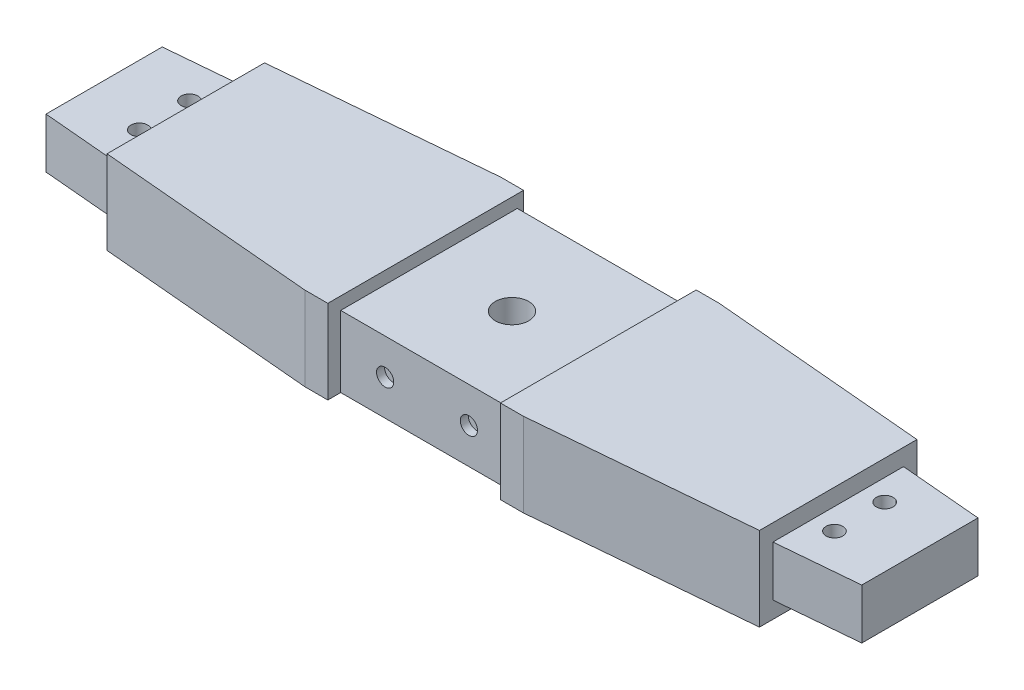
ISO-10303-21;
HEADER;
FILE_DESCRIPTION(('STEP AP214'),'2;1');
FILE_NAME('part.step','',(''),(''),'','','');
FILE_SCHEMA(('AUTOMOTIVE_DESIGN { 1 0 10303 214 1 1 1 1 }'));
ENDSEC;
DATA;
#1=APPLICATION_CONTEXT('core data for automotive mechanical design processes');
#2=APPLICATION_PROTOCOL_DEFINITION('international standard','automotive_design',2000,#1);
#3=PRODUCT_CONTEXT('',#1,'mechanical');
#4=PRODUCT('Part','Part','',(#3));
#5=PRODUCT_RELATED_PRODUCT_CATEGORY('part','',(#4));
#6=PRODUCT_DEFINITION_FORMATION('','',#4);
#7=PRODUCT_DEFINITION_CONTEXT('part definition',#1,'design');
#8=PRODUCT_DEFINITION('design','',#6,#7);
#9=PRODUCT_DEFINITION_SHAPE('','',#8);
#10=(LENGTH_UNIT() NAMED_UNIT(*) SI_UNIT(.MILLI.,.METRE.));
#11=(NAMED_UNIT(*) PLANE_ANGLE_UNIT() SI_UNIT($,.RADIAN.));
#12=(NAMED_UNIT(*) SI_UNIT($,.STERADIAN.) SOLID_ANGLE_UNIT());
#13=UNCERTAINTY_MEASURE_WITH_UNIT(LENGTH_MEASURE(1.E-05),#10,'distance_accuracy_value','');
#14=(GEOMETRIC_REPRESENTATION_CONTEXT(3) GLOBAL_UNCERTAINTY_ASSIGNED_CONTEXT((#13)) GLOBAL_UNIT_ASSIGNED_CONTEXT((#10,
#11,#12)) REPRESENTATION_CONTEXT('',''));
#15=CARTESIAN_POINT('',(0.,0.,0.));
#16=DIRECTION('',(0.,0.,1.));
#17=DIRECTION('',(1.,0.,0.));
#18=AXIS2_PLACEMENT_3D('',#15,#16,#17);
#19=CARTESIAN_POINT('',(0.,13.,0.));
#20=DIRECTION('',(0.,1.,0.));
#21=DIRECTION('',(0.,0.,1.));
#22=AXIS2_PLACEMENT_3D('',#19,#20,#21);
#23=PLANE('',#22);
#24=CARTESIAN_POINT('',(0.,13.,0.));
#25=DIRECTION('',(0.,1.,0.));
#26=DIRECTION('',(0.,0.,1.));
#27=AXIS2_PLACEMENT_3D('',#24,#25,#26);
#28=CIRCLE('',#27,3.99999999999999);
#29=CARTESIAN_POINT('',(0.,13.,3.99999999999999));
#30=VERTEX_POINT('',#29);
#31=EDGE_CURVE('E585',#30,#30,#28,.T.);
#32=ORIENTED_EDGE('',*,*,#31,.F.);
#33=EDGE_LOOP('',(#32));
#34=FACE_BOUND('',#33,.T.);
#35=DIRECTION('',(-1.,0.,0.));
#36=VECTOR('',#35,1.);
#37=CARTESIAN_POINT('',(20.6098777813811,13.,-21.87));
#38=LINE('',#37,#36);
#39=CARTESIAN_POINT('',(20.6098777813811,13.,-21.87));
#40=VERTEX_POINT('',#39);
#41=CARTESIAN_POINT('',(-20.6098777813811,13.,-21.87));
#42=VERTEX_POINT('',#41);
#43=EDGE_CURVE('E295',#40,#42,#38,.T.);
#44=ORIENTED_EDGE('',*,*,#43,.T.);
#45=DIRECTION('',(0.,0.,-1.));
#46=VECTOR('',#45,1.);
#47=CARTESIAN_POINT('',(-20.6098777813811,13.,23.37));
#48=LINE('',#47,#46);
#49=CARTESIAN_POINT('',(-20.6098777813811,13.,20.2957801884778));
#50=VERTEX_POINT('',#49);
#51=EDGE_CURVE('E258',#50,#42,#48,.T.);
#52=ORIENTED_EDGE('',*,*,#51,.F.);
#53=DIRECTION('',(1.,0.,0.));
#54=VECTOR('',#53,1.);
#55=CARTESIAN_POINT('',(-20.6098777813811,13.,20.2957801884778));
#56=LINE('',#55,#54);
#57=CARTESIAN_POINT('',(20.6098777813811,13.,20.2957801884778));
#58=VERTEX_POINT('',#57);
#59=EDGE_CURVE('E313',#50,#58,#56,.T.);
#60=ORIENTED_EDGE('',*,*,#59,.T.);
#61=DIRECTION('',(0.,0.,1.));
#62=VECTOR('',#61,1.);
#63=CARTESIAN_POINT('',(20.6098777813811,13.,-23.37));
#64=LINE('',#63,#62);
#65=EDGE_CURVE('E11',#40,#58,#64,.T.);
#66=ORIENTED_EDGE('',*,*,#65,.F.);
#67=EDGE_LOOP('',(#44,#52,#60,#66));
#68=FACE_BOUND('',#67,.T.);
#69=ADVANCED_FACE('F36',(#34,#68),#23,.T.);
#70=CARTESIAN_POINT('',(26.0807930555945,-4.00000000000002,-23.37));
#71=DIRECTION('',(0.,0.,-1.));
#72=DIRECTION('',(-1.,0.,0.));
#73=AXIS2_PLACEMENT_3D('',#70,#71,#72);
#74=PLANE('',#73);
#75=DIRECTION('',(0.,-1.,0.));
#76=VECTOR('',#75,1.);
#77=CARTESIAN_POINT('',(-20.6098777813811,13.,-23.37));
#78=LINE('',#77,#76);
#79=CARTESIAN_POINT('',(-20.6098777813811,16.,-23.37));
#80=VERTEX_POINT('',#79);
#81=CARTESIAN_POINT('',(-20.6098777813811,-4.00000000000002,-23.37));
#82=VERTEX_POINT('',#81);
#83=EDGE_CURVE('E95',#80,#82,#78,.T.);
#84=ORIENTED_EDGE('',*,*,#83,.T.);
#85=DIRECTION('',(-1.,0.,0.));
#86=VECTOR('',#85,1.);
#87=CARTESIAN_POINT('',(26.0807930555945,-4.00000000000002,-23.37));
#88=LINE('',#87,#86);
#89=CARTESIAN_POINT('',(-26.0807930555945,-4.00000000000002,-23.37));
#90=VERTEX_POINT('',#89);
#91=EDGE_CURVE('E348',#82,#90,#88,.T.);
#92=ORIENTED_EDGE('',*,*,#91,.T.);
#93=DIRECTION('',(0.,1.,0.));
#94=VECTOR('',#93,1.);
#95=CARTESIAN_POINT('',(-26.0807930555945,-4.00000000000002,-23.37));
#96=LINE('',#95,#94);
#97=CARTESIAN_POINT('',(-26.0807930555945,16.,-23.37));
#98=VERTEX_POINT('',#97);
#99=EDGE_CURVE('E362',#90,#98,#96,.T.);
#100=ORIENTED_EDGE('',*,*,#99,.T.);
#101=DIRECTION('',(-1.,0.,0.));
#102=VECTOR('',#101,1.);
#103=CARTESIAN_POINT('',(-20.6098777813811,16.,-23.37));
#104=LINE('',#103,#102);
#105=EDGE_CURVE('E257',#80,#98,#104,.T.);
#106=ORIENTED_EDGE('',*,*,#105,.F.);
#107=EDGE_LOOP('',(#84,#92,#100,#106));
#108=FACE_BOUND('',#107,.T.);
#109=ADVANCED_FACE('F446',(#108),#74,.T.);
#110=CARTESIAN_POINT('',(-26.0807930555945,-4.00000000000002,23.37));
#111=DIRECTION('',(0.,0.,1.));
#112=DIRECTION('',(1.,0.,0.));
#113=AXIS2_PLACEMENT_3D('',#110,#111,#112);
#114=PLANE('',#113);
#115=DIRECTION('',(0.,-1.,0.));
#116=VECTOR('',#115,1.);
#117=CARTESIAN_POINT('',(20.6098777813811,13.,23.37));
#118=LINE('',#117,#116);
#119=CARTESIAN_POINT('',(20.6098777813811,16.,23.37));
#120=VERTEX_POINT('',#119);
#121=CARTESIAN_POINT('',(20.6098777813811,-4.00000000000002,23.37));
#122=VERTEX_POINT('',#121);
#123=EDGE_CURVE('E316',#120,#122,#118,.T.);
#124=ORIENTED_EDGE('',*,*,#123,.T.);
#125=DIRECTION('',(1.,0.,0.));
#126=VECTOR('',#125,1.);
#127=CARTESIAN_POINT('',(-26.0807930555945,-4.00000000000002,23.37));
#128=LINE('',#127,#126);
#129=CARTESIAN_POINT('',(26.0807930555945,-4.00000000000002,23.37));
#130=VERTEX_POINT('',#129);
#131=EDGE_CURVE('E335',#122,#130,#128,.T.);
#132=ORIENTED_EDGE('',*,*,#131,.T.);
#133=DIRECTION('',(0.,1.,0.));
#134=VECTOR('',#133,1.);
#135=CARTESIAN_POINT('',(26.0807930555945,-4.00000000000002,23.37));
#136=LINE('',#135,#134);
#137=CARTESIAN_POINT('',(26.0807930555945,16.,23.37));
#138=VERTEX_POINT('',#137);
#139=EDGE_CURVE('E370',#130,#138,#136,.T.);
#140=ORIENTED_EDGE('',*,*,#139,.T.);
#141=DIRECTION('',(1.,0.,0.));
#142=VECTOR('',#141,1.);
#143=CARTESIAN_POINT('',(20.6098777813811,16.,23.37));
#144=LINE('',#143,#142);
#145=EDGE_CURVE('E279',#120,#138,#144,.T.);
#146=ORIENTED_EDGE('',*,*,#145,.F.);
#147=EDGE_LOOP('',(#124,#132,#140,#146));
#148=FACE_BOUND('',#147,.T.);
#149=ADVANCED_FACE('F452',(#148),#114,.T.);
#150=CARTESIAN_POINT('',(-77.9,-4.00000000000002,18.8061604361873));
#151=DIRECTION('',(-0.0877327517225181,0.,0.996144047954509));
#152=DIRECTION('',(0.996144047954509,0.,0.0877327517225181));
#153=AXIS2_PLACEMENT_3D('',#150,#151,#152);
#154=PLANE('',#153);
#155=DIRECTION('',(0.,1.,0.));
#156=VECTOR('',#155,1.);
#157=CARTESIAN_POINT('',(-26.0807930555945,-4.00000000000002,23.37));
#158=LINE('',#157,#156);
#159=CARTESIAN_POINT('',(-26.0807930555945,-4.00000000000002,23.37));
#160=VERTEX_POINT('',#159);
#161=CARTESIAN_POINT('',(-26.0807930555945,16.,23.37));
#162=VERTEX_POINT('',#161);
#163=EDGE_CURVE('E358',#160,#162,#158,.T.);
#164=ORIENTED_EDGE('',*,*,#163,.T.);
#165=DIRECTION('',(0.996144047954509,0.,0.0877327517225181));
#166=VECTOR('',#165,1.);
#167=CARTESIAN_POINT('',(-77.9,16.,18.8061604361873));
#168=LINE('',#167,#166);
#169=CARTESIAN_POINT('',(-77.9,16.,18.8061604361873));
#170=VERTEX_POINT('',#169);
#171=EDGE_CURVE('E267',#170,#162,#168,.T.);
#172=ORIENTED_EDGE('',*,*,#171,.F.);
#173=DIRECTION('',(0.,1.,0.));
#174=VECTOR('',#173,1.);
#175=CARTESIAN_POINT('',(-77.9,-4.00000000000002,18.8061604361873));
#176=LINE('',#175,#174);
#177=CARTESIAN_POINT('',(-77.9,-4.00000000000002,18.8061604361873));
#178=VERTEX_POINT('',#177);
#179=EDGE_CURVE('E46',#178,#170,#176,.T.);
#180=ORIENTED_EDGE('',*,*,#179,.F.);
#181=DIRECTION('',(0.996144047954509,0.,0.0877327517225181));
#182=VECTOR('',#181,1.);
#183=CARTESIAN_POINT('',(-77.9,-4.00000000000002,18.8061604361873));
#184=LINE('',#183,#182);
#185=EDGE_CURVE('E326',#178,#160,#184,.T.);
#186=ORIENTED_EDGE('',*,*,#185,.T.);
#187=EDGE_LOOP('',(#164,#172,#180,#186));
#188=FACE_BOUND('',#187,.T.);
#189=ADVANCED_FACE('F465',(#188),#154,.T.);
#190=CARTESIAN_POINT('',(-77.9,-4.00000000000002,-18.8061604361873));
#191=DIRECTION('',(-1.,0.,0.));
#192=DIRECTION('',(0.,0.,1.));
#193=AXIS2_PLACEMENT_3D('',#190,#191,#192);
#194=PLANE('',#193);
#195=DIRECTION('',(0.,1.,0.));
#196=VECTOR('',#195,1.);
#197=CARTESIAN_POINT('',(-77.9,12.,15.5963822751002));
#198=LINE('',#197,#196);
#199=CARTESIAN_POINT('',(-77.9,0.,15.5963822751002));
#200=VERTEX_POINT('',#199);
#201=CARTESIAN_POINT('',(-77.9,12.,15.5963822751002));
#202=VERTEX_POINT('',#201);
#203=EDGE_CURVE('E55',#200,#202,#198,.T.);
#204=ORIENTED_EDGE('',*,*,#203,.F.);
#205=DIRECTION('',(0.,0.,1.));
#206=VECTOR('',#205,1.);
#207=CARTESIAN_POINT('',(-77.9,0.,15.5963822751002));
#208=LINE('',#207,#206);
#209=CARTESIAN_POINT('',(-77.9,0.,-15.5963822751002));
#210=VERTEX_POINT('',#209);
#211=EDGE_CURVE('E235',#210,#200,#208,.T.);
#212=ORIENTED_EDGE('',*,*,#211,.F.);
#213=DIRECTION('',(0.,-1.,0.));
#214=VECTOR('',#213,1.);
#215=CARTESIAN_POINT('',(-77.9,0.,-15.5963822751002));
#216=LINE('',#215,#214);
#217=CARTESIAN_POINT('',(-77.9,12.,-15.5963822751002));
#218=VERTEX_POINT('',#217);
#219=EDGE_CURVE('E206',#218,#210,#216,.T.);
#220=ORIENTED_EDGE('',*,*,#219,.F.);
#221=DIRECTION('',(0.,0.,-1.));
#222=VECTOR('',#221,1.);
#223=CARTESIAN_POINT('',(-77.9,12.,-15.5963822751002));
#224=LINE('',#223,#222);
#225=EDGE_CURVE('E201',#202,#218,#224,.T.);
#226=ORIENTED_EDGE('',*,*,#225,.F.);
#227=EDGE_LOOP('',(#204,#212,#220,#226));
#228=FACE_BOUND('',#227,.T.);
#229=ORIENTED_EDGE('',*,*,#179,.T.);
#230=DIRECTION('',(0.,0.,1.));
#231=VECTOR('',#230,1.);
#232=CARTESIAN_POINT('',(-77.9,16.,-18.8061604361873));
#233=LINE('',#232,#231);
#234=CARTESIAN_POINT('',(-77.9,16.,-18.8061604361873));
#235=VERTEX_POINT('',#234);
#236=EDGE_CURVE('E264',#235,#170,#233,.T.);
#237=ORIENTED_EDGE('',*,*,#236,.F.);
#238=DIRECTION('',(0.,1.,0.));
#239=VECTOR('',#238,1.);
#240=CARTESIAN_POINT('',(-77.9,-4.00000000000002,-18.8061604361873));
#241=LINE('',#240,#239);
#242=CARTESIAN_POINT('',(-77.9,-4.00000000000002,-18.8061604361873));
#243=VERTEX_POINT('',#242);
#244=EDGE_CURVE('E360',#243,#235,#241,.T.);
#245=ORIENTED_EDGE('',*,*,#244,.F.);
#246=DIRECTION('',(0.,0.,1.));
#247=VECTOR('',#246,1.);
#248=CARTESIAN_POINT('',(-77.9,-4.00000000000002,-18.8061604361873));
#249=LINE('',#248,#247);
#250=EDGE_CURVE('E355',#243,#178,#249,.T.);
#251=ORIENTED_EDGE('',*,*,#250,.T.);
#252=EDGE_LOOP('',(#229,#237,#245,#251));
#253=FACE_BOUND('',#252,.T.);
#254=ADVANCED_FACE('F203',(#228,#253),#194,.T.);
#255=CARTESIAN_POINT('',(-26.0807930555945,-4.00000000000002,-23.37));
#256=DIRECTION('',(-0.0877327517225181,0.,-0.996144047954509));
#257=DIRECTION('',(-0.996144047954509,0.,0.0877327517225181));
#258=AXIS2_PLACEMENT_3D('',#255,#256,#257);
#259=PLANE('',#258);
#260=ORIENTED_EDGE('',*,*,#244,.T.);
#261=DIRECTION('',(-0.996144047954509,0.,0.0877327517225181));
#262=VECTOR('',#261,1.);
#263=CARTESIAN_POINT('',(-26.0807930555945,16.,-23.37));
#264=LINE('',#263,#262);
#265=EDGE_CURVE('E261',#98,#235,#264,.T.);
#266=ORIENTED_EDGE('',*,*,#265,.F.);
#267=ORIENTED_EDGE('',*,*,#99,.F.);
#268=DIRECTION('',(-0.996144047954509,0.,0.0877327517225181));
#269=VECTOR('',#268,1.);
#270=CARTESIAN_POINT('',(-26.0807930555945,-4.00000000000002,-23.37));
#271=LINE('',#270,#269);
#272=EDGE_CURVE('E352',#90,#243,#271,.T.);
#273=ORIENTED_EDGE('',*,*,#272,.T.);
#274=EDGE_LOOP('',(#260,#266,#267,#273));
#275=FACE_BOUND('',#274,.T.);
#276=ADVANCED_FACE('F464',(#275),#259,.T.);
#277=DIRECTION('',(0.,-1.,0.));
#278=VECTOR('',#277,1.);
#279=CARTESIAN_POINT('',(20.6098777813811,13.,-23.37));
#280=LINE('',#279,#278);
#281=CARTESIAN_POINT('',(20.6098777813811,16.,-23.37));
#282=VERTEX_POINT('',#281);
#283=CARTESIAN_POINT('',(20.6098777813811,-4.00000000000002,-23.37));
#284=VERTEX_POINT('',#283);
#285=EDGE_CURVE('E310',#282,#284,#280,.T.);
#286=ORIENTED_EDGE('',*,*,#285,.F.);
#287=DIRECTION('',(-1.,0.,0.));
#288=VECTOR('',#287,1.);
#289=CARTESIAN_POINT('',(26.0807930555945,16.,-23.37));
#290=LINE('',#289,#288);
#291=CARTESIAN_POINT('',(26.0807930555945,16.,-23.37));
#292=VERTEX_POINT('',#291);
#293=EDGE_CURVE('E291',#292,#282,#290,.T.);
#294=ORIENTED_EDGE('',*,*,#293,.F.);
#295=DIRECTION('',(0.,1.,0.));
#296=VECTOR('',#295,1.);
#297=CARTESIAN_POINT('',(26.0807930555945,-4.00000000000002,-23.37));
#298=LINE('',#297,#296);
#299=CARTESIAN_POINT('',(26.0807930555945,-4.00000000000002,-23.37));
#300=VERTEX_POINT('',#299);
#301=EDGE_CURVE('E364',#300,#292,#298,.T.);
#302=ORIENTED_EDGE('',*,*,#301,.F.);
#303=EDGE_CURVE('E349',#300,#284,#88,.T.);
#304=ORIENTED_EDGE('',*,*,#303,.T.);
#305=EDGE_LOOP('',(#286,#294,#302,#304));
#306=FACE_BOUND('',#305,.T.);
#307=ADVANCED_FACE('F455',(#306),#74,.T.);
#308=CARTESIAN_POINT('',(77.9,-4.00000000000002,-18.8061604361873));
#309=DIRECTION('',(0.0877327517225181,0.,-0.996144047954509));
#310=DIRECTION('',(-0.996144047954509,0.,-0.0877327517225181));
#311=AXIS2_PLACEMENT_3D('',#308,#309,#310);
#312=PLANE('',#311);
#313=ORIENTED_EDGE('',*,*,#301,.T.);
#314=DIRECTION('',(-0.996144047954509,0.,-0.0877327517225181));
#315=VECTOR('',#314,1.);
#316=CARTESIAN_POINT('',(77.9,16.,-18.8061604361873));
#317=LINE('',#316,#315);
#318=CARTESIAN_POINT('',(77.9,16.,-18.8061604361873));
#319=VERTEX_POINT('',#318);
#320=EDGE_CURVE('E288',#319,#292,#317,.T.);
#321=ORIENTED_EDGE('',*,*,#320,.F.);
#322=DIRECTION('',(0.,1.,0.));
#323=VECTOR('',#322,1.);
#324=CARTESIAN_POINT('',(77.9,-4.00000000000002,-18.8061604361873));
#325=LINE('',#324,#323);
#326=CARTESIAN_POINT('',(77.9,-4.00000000000002,-18.8061604361873));
#327=VERTEX_POINT('',#326);
#328=EDGE_CURVE('E366',#327,#319,#325,.T.);
#329=ORIENTED_EDGE('',*,*,#328,.F.);
#330=DIRECTION('',(-0.996144047954509,0.,-0.0877327517225181));
#331=VECTOR('',#330,1.);
#332=CARTESIAN_POINT('',(77.9,-4.00000000000002,-18.8061604361873));
#333=LINE('',#332,#331);
#334=EDGE_CURVE('E345',#327,#300,#333,.T.);
#335=ORIENTED_EDGE('',*,*,#334,.T.);
#336=EDGE_LOOP('',(#313,#321,#329,#335));
#337=FACE_BOUND('',#336,.T.);
#338=ADVANCED_FACE('F470',(#337),#312,.T.);
#339=CARTESIAN_POINT('',(77.9,-4.00000000000002,18.8061604361873));
#340=DIRECTION('',(1.,0.,0.));
#341=DIRECTION('',(0.,0.,-1.));
#342=AXIS2_PLACEMENT_3D('',#339,#340,#341);
#343=PLANE('',#342);
#344=DIRECTION('',(0.,1.,0.));
#345=VECTOR('',#344,1.);
#346=CARTESIAN_POINT('',(77.9,12.,-15.5963822751002));
#347=LINE('',#346,#345);
#348=CARTESIAN_POINT('',(77.9,0.,-15.5963822751002));
#349=VERTEX_POINT('',#348);
#350=CARTESIAN_POINT('',(77.9,12.,-15.5963822751002));
#351=VERTEX_POINT('',#350);
#352=EDGE_CURVE('E218',#349,#351,#347,.T.);
#353=ORIENTED_EDGE('',*,*,#352,.F.);
#354=DIRECTION('',(0.,0.,-1.));
#355=VECTOR('',#354,1.);
#356=CARTESIAN_POINT('',(77.9,0.,-15.5963822751002));
#357=LINE('',#356,#355);
#358=CARTESIAN_POINT('',(77.9,0.,15.5963822751002));
#359=VERTEX_POINT('',#358);
#360=EDGE_CURVE('E252',#359,#349,#357,.T.);
#361=ORIENTED_EDGE('',*,*,#360,.F.);
#362=DIRECTION('',(0.,-1.,0.));
#363=VECTOR('',#362,1.);
#364=CARTESIAN_POINT('',(77.9,0.,15.5963822751002));
#365=LINE('',#364,#363);
#366=CARTESIAN_POINT('',(77.9,12.,15.5963822751002));
#367=VERTEX_POINT('',#366);
#368=EDGE_CURVE('E249',#367,#359,#365,.T.);
#369=ORIENTED_EDGE('',*,*,#368,.F.);
#370=DIRECTION('',(0.,0.,1.));
#371=VECTOR('',#370,1.);
#372=CARTESIAN_POINT('',(77.9,12.,15.5963822751002));
#373=LINE('',#372,#371);
#374=EDGE_CURVE('E246',#351,#367,#373,.T.);
#375=ORIENTED_EDGE('',*,*,#374,.F.);
#376=EDGE_LOOP('',(#353,#361,#369,#375));
#377=FACE_BOUND('',#376,.T.);
#378=ORIENTED_EDGE('',*,*,#328,.T.);
#379=DIRECTION('',(0.,0.,-1.));
#380=VECTOR('',#379,1.);
#381=CARTESIAN_POINT('',(77.9,16.,18.8061604361873));
#382=LINE('',#381,#380);
#383=CARTESIAN_POINT('',(77.9,16.,18.8061604361873));
#384=VERTEX_POINT('',#383);
#385=EDGE_CURVE('E285',#384,#319,#382,.T.);
#386=ORIENTED_EDGE('',*,*,#385,.F.);
#387=DIRECTION('',(0.,1.,0.));
#388=VECTOR('',#387,1.);
#389=CARTESIAN_POINT('',(77.9,-4.00000000000002,18.8061604361873));
#390=LINE('',#389,#388);
#391=CARTESIAN_POINT('',(77.9,-4.00000000000002,18.8061604361873));
#392=VERTEX_POINT('',#391);
#393=EDGE_CURVE('E368',#392,#384,#390,.T.);
#394=ORIENTED_EDGE('',*,*,#393,.F.);
#395=DIRECTION('',(0.,0.,-1.));
#396=VECTOR('',#395,1.);
#397=CARTESIAN_POINT('',(77.9,-4.00000000000002,18.8061604361873));
#398=LINE('',#397,#396);
#399=EDGE_CURVE('E342',#392,#327,#398,.T.);
#400=ORIENTED_EDGE('',*,*,#399,.T.);
#401=EDGE_LOOP('',(#378,#386,#394,#400));
#402=FACE_BOUND('',#401,.T.);
#403=ADVANCED_FACE('F474',(#377,#402),#343,.T.);
#404=CARTESIAN_POINT('',(26.0807930555945,-4.00000000000002,23.37));
#405=DIRECTION('',(0.0877327517225181,0.,0.996144047954509));
#406=DIRECTION('',(0.996144047954509,0.,-0.0877327517225181));
#407=AXIS2_PLACEMENT_3D('',#404,#405,#406);
#408=PLANE('',#407);
#409=ORIENTED_EDGE('',*,*,#393,.T.);
#410=DIRECTION('',(0.996144047954509,0.,-0.0877327517225181));
#411=VECTOR('',#410,1.);
#412=CARTESIAN_POINT('',(26.0807930555945,16.,23.37));
#413=LINE('',#412,#411);
#414=EDGE_CURVE('E282',#138,#384,#413,.T.);
#415=ORIENTED_EDGE('',*,*,#414,.F.);
#416=ORIENTED_EDGE('',*,*,#139,.F.);
#417=DIRECTION('',(0.996144047954509,0.,-0.0877327517225181));
#418=VECTOR('',#417,1.);
#419=CARTESIAN_POINT('',(26.0807930555945,-4.00000000000002,23.37));
#420=LINE('',#419,#418);
#421=EDGE_CURVE('E339',#130,#392,#420,.T.);
#422=ORIENTED_EDGE('',*,*,#421,.T.);
#423=EDGE_LOOP('',(#409,#415,#416,#422));
#424=FACE_BOUND('',#423,.T.);
#425=ADVANCED_FACE('F478',(#424),#408,.T.);
#426=DIRECTION('',(0.,-1.,0.));
#427=VECTOR('',#426,1.);
#428=CARTESIAN_POINT('',(-20.6098777813811,13.,23.37));
#429=LINE('',#428,#427);
#430=CARTESIAN_POINT('',(-20.6098777813811,16.,23.37));
#431=VERTEX_POINT('',#430);
#432=CARTESIAN_POINT('',(-20.6098777813811,-4.00000000000002,23.37));
#433=VERTEX_POINT('',#432);
#434=EDGE_CURVE('E329',#431,#433,#429,.T.);
#435=ORIENTED_EDGE('',*,*,#434,.F.);
#436=DIRECTION('',(1.,0.,0.));
#437=VECTOR('',#436,1.);
#438=CARTESIAN_POINT('',(-26.0807930555945,16.,23.37));
#439=LINE('',#438,#437);
#440=EDGE_CURVE('E270',#162,#431,#439,.T.);
#441=ORIENTED_EDGE('',*,*,#440,.F.);
#442=ORIENTED_EDGE('',*,*,#163,.F.);
#443=EDGE_CURVE('E336',#160,#433,#128,.T.);
#444=ORIENTED_EDGE('',*,*,#443,.T.);
#445=EDGE_LOOP('',(#435,#441,#442,#444));
#446=FACE_BOUND('',#445,.T.);
#447=ADVANCED_FACE('F482',(#446),#114,.T.);
#448=CARTESIAN_POINT('',(0.,-4.00000000000002,0.));
#449=DIRECTION('',(0.,1.,0.));
#450=DIRECTION('',(0.,0.,1.));
#451=AXIS2_PLACEMENT_3D('',#448,#449,#450);
#452=PLANE('',#451);
#453=CARTESIAN_POINT('',(0.,-4.00000000000002,0.));
#454=DIRECTION('',(0.,-1.,0.));
#455=DIRECTION('',(0.,0.,-1.));
#456=AXIS2_PLACEMENT_3D('',#453,#454,#455);
#457=CIRCLE('',#456,3.99999999999999);
#458=CARTESIAN_POINT('',(0.,-4.00000000000002,-3.99999999999999));
#459=VERTEX_POINT('',#458);
#460=EDGE_CURVE('E583',#459,#459,#457,.T.);
#461=ORIENTED_EDGE('',*,*,#460,.F.);
#462=EDGE_LOOP('',(#461));
#463=FACE_BOUND('',#462,.T.);
#464=ORIENTED_EDGE('',*,*,#91,.F.);
#465=DIRECTION('',(0.,0.,-1.));
#466=VECTOR('',#465,1.);
#467=CARTESIAN_POINT('',(-20.6098777813811,-4.00000000000002,-21.87));
#468=LINE('',#467,#466);
#469=CARTESIAN_POINT('',(-20.6098777813811,-4.00000000000002,-21.87));
#470=VERTEX_POINT('',#469);
#471=EDGE_CURVE('E293',#470,#82,#468,.T.);
#472=ORIENTED_EDGE('',*,*,#471,.F.);
#473=DIRECTION('',(-1.,0.,0.));
#474=VECTOR('',#473,1.);
#475=CARTESIAN_POINT('',(20.6098777813811,-4.00000000000002,-21.87));
#476=LINE('',#475,#474);
#477=CARTESIAN_POINT('',(20.6098777813811,-4.00000000000002,-21.87));
#478=VERTEX_POINT('',#477);
#479=EDGE_CURVE('E298',#478,#470,#476,.T.);
#480=ORIENTED_EDGE('',*,*,#479,.F.);
#481=DIRECTION('',(0.,0.,1.));
#482=VECTOR('',#481,1.);
#483=CARTESIAN_POINT('',(20.6098777813811,-4.00000000000002,-23.37));
#484=LINE('',#483,#482);
#485=EDGE_CURVE('E300',#284,#478,#484,.T.);
#486=ORIENTED_EDGE('',*,*,#485,.F.);
#487=ORIENTED_EDGE('',*,*,#303,.F.);
#488=ORIENTED_EDGE('',*,*,#334,.F.);
#489=ORIENTED_EDGE('',*,*,#399,.F.);
#490=ORIENTED_EDGE('',*,*,#421,.F.);
#491=ORIENTED_EDGE('',*,*,#131,.F.);
#492=DIRECTION('',(0.,0.,1.));
#493=VECTOR('',#492,1.);
#494=CARTESIAN_POINT('',(20.6098777813811,-4.00000000000002,20.2957801884778));
#495=LINE('',#494,#493);
#496=CARTESIAN_POINT('',(20.6098777813811,-4.00000000000002,20.2957801884778));
#497=VERTEX_POINT('',#496);
#498=EDGE_CURVE('E307',#497,#122,#495,.T.);
#499=ORIENTED_EDGE('',*,*,#498,.F.);
#500=DIRECTION('',(1.,0.,0.));
#501=VECTOR('',#500,1.);
#502=CARTESIAN_POINT('',(-20.6098777813811,-4.00000000000002,20.2957801884778));
#503=LINE('',#502,#501);
#504=CARTESIAN_POINT('',(-20.6098777813811,-4.00000000000002,20.2957801884778));
#505=VERTEX_POINT('',#504);
#506=EDGE_CURVE('E317',#505,#497,#503,.T.);
#507=ORIENTED_EDGE('',*,*,#506,.F.);
#508=DIRECTION('',(0.,0.,-1.));
#509=VECTOR('',#508,1.);
#510=CARTESIAN_POINT('',(-20.6098777813811,-4.00000000000002,23.37));
#511=LINE('',#510,#509);
#512=EDGE_CURVE('E319',#433,#505,#511,.T.);
#513=ORIENTED_EDGE('',*,*,#512,.F.);
#514=ORIENTED_EDGE('',*,*,#443,.F.);
#515=ORIENTED_EDGE('',*,*,#185,.F.);
#516=ORIENTED_EDGE('',*,*,#250,.F.);
#517=ORIENTED_EDGE('',*,*,#272,.F.);
#518=EDGE_LOOP('',(#464,#472,#480,#486,#487,#488,#489,#490,#491,#499,#507,#513,#514,#515,#516,#517));
#519=FACE_BOUND('',#518,.T.);
#520=ADVANCED_FACE('F460',(#463,#519),#452,.F.);
#521=CARTESIAN_POINT('',(20.6098777813811,13.,20.2957801884778));
#522=DIRECTION('',(1.,0.,0.));
#523=DIRECTION('',(0.,1.,0.));
#524=AXIS2_PLACEMENT_3D('',#521,#522,#523);
#525=PLANE('',#524);
#526=ORIENTED_EDGE('',*,*,#498,.T.);
#527=ORIENTED_EDGE('',*,*,#123,.F.);
#528=DIRECTION('',(0.,0.,1.));
#529=VECTOR('',#528,1.);
#530=CARTESIAN_POINT('',(20.6098777813811,16.,20.2957801884778));
#531=LINE('',#530,#529);
#532=EDGE_CURVE('E273',#282,#120,#531,.T.);
#533=ORIENTED_EDGE('',*,*,#532,.F.);
#534=ORIENTED_EDGE('',*,*,#285,.T.);
#535=ORIENTED_EDGE('',*,*,#485,.T.);
#536=DIRECTION('',(0.,-1.,0.));
#537=VECTOR('',#536,1.);
#538=CARTESIAN_POINT('',(20.6098777813811,13.,-21.87));
#539=LINE('',#538,#537);
#540=EDGE_CURVE('E308',#40,#478,#539,.T.);
#541=ORIENTED_EDGE('',*,*,#540,.F.);
#542=ORIENTED_EDGE('',*,*,#65,.T.);
#543=DIRECTION('',(0.,-1.,0.));
#544=VECTOR('',#543,1.);
#545=CARTESIAN_POINT('',(20.6098777813811,13.,20.2957801884778));
#546=LINE('',#545,#544);
#547=EDGE_CURVE('E324',#58,#497,#546,.T.);
#548=ORIENTED_EDGE('',*,*,#547,.T.);
#549=EDGE_LOOP('',(#526,#527,#533,#534,#535,#541,#542,#548));
#550=FACE_BOUND('',#549,.T.);
#551=ADVANCED_FACE('F532',(#550),#525,.F.);
#552=CARTESIAN_POINT('',(-20.6098777813811,13.,20.2957801884778));
#553=DIRECTION('',(0.,0.,-1.));
#554=DIRECTION('',(-1.,0.,0.));
#555=AXIS2_PLACEMENT_3D('',#552,#553,#554);
#556=PLANE('',#555);
#557=CARTESIAN_POINT('',(-10.,4.5,20.2957801884778));
#558=DIRECTION('',(0.,0.,-1.));
#559=DIRECTION('',(-1.,0.,0.));
#560=AXIS2_PLACEMENT_3D('',#557,#558,#559);
#561=CIRCLE('',#560,2.04999999999999);
#562=CARTESIAN_POINT('',(-12.05,4.5,20.2957801884778));
#563=VERTEX_POINT('',#562);
#564=EDGE_CURVE('E393',#563,#563,#561,.T.);
#565=ORIENTED_EDGE('',*,*,#564,.T.);
#566=EDGE_LOOP('',(#565));
#567=FACE_BOUND('',#566,.T.);
#568=CARTESIAN_POINT('',(10.,4.5,20.2957801884778));
#569=DIRECTION('',(0.,0.,-1.));
#570=DIRECTION('',(-1.,0.,0.));
#571=AXIS2_PLACEMENT_3D('',#568,#569,#570);
#572=CIRCLE('',#571,2.04999999999999);
#573=CARTESIAN_POINT('',(7.95000000000001,4.5,20.2957801884778));
#574=VERTEX_POINT('',#573);
#575=EDGE_CURVE('E225',#574,#574,#572,.T.);
#576=ORIENTED_EDGE('',*,*,#575,.T.);
#577=EDGE_LOOP('',(#576));
#578=FACE_BOUND('',#577,.T.);
#579=ORIENTED_EDGE('',*,*,#506,.T.);
#580=ORIENTED_EDGE('',*,*,#547,.F.);
#581=ORIENTED_EDGE('',*,*,#59,.F.);
#582=DIRECTION('',(0.,-1.,0.));
#583=VECTOR('',#582,1.);
#584=CARTESIAN_POINT('',(-20.6098777813811,13.,20.2957801884778));
#585=LINE('',#584,#583);
#586=EDGE_CURVE('E327',#50,#505,#585,.T.);
#587=ORIENTED_EDGE('',*,*,#586,.T.);
#588=EDGE_LOOP('',(#579,#580,#581,#587));
#589=FACE_BOUND('',#588,.T.);
#590=ADVANCED_FACE('F544',(#567,#578,#589),#556,.F.);
#591=CARTESIAN_POINT('',(-20.6098777813811,13.,23.37));
#592=DIRECTION('',(-1.,0.,0.));
#593=DIRECTION('',(0.,-1.,0.));
#594=AXIS2_PLACEMENT_3D('',#591,#592,#593);
#595=PLANE('',#594);
#596=ORIENTED_EDGE('',*,*,#512,.T.);
#597=ORIENTED_EDGE('',*,*,#586,.F.);
#598=ORIENTED_EDGE('',*,*,#51,.T.);
#599=DIRECTION('',(0.,-1.,0.));
#600=VECTOR('',#599,1.);
#601=CARTESIAN_POINT('',(-20.6098777813811,13.,-21.87));
#602=LINE('',#601,#600);
#603=EDGE_CURVE('E305',#42,#470,#602,.T.);
#604=ORIENTED_EDGE('',*,*,#603,.T.);
#605=ORIENTED_EDGE('',*,*,#471,.T.);
#606=ORIENTED_EDGE('',*,*,#83,.F.);
#607=DIRECTION('',(0.,0.,-1.));
#608=VECTOR('',#607,1.);
#609=CARTESIAN_POINT('',(-20.6098777813811,16.,20.2957801884778));
#610=LINE('',#609,#608);
#611=EDGE_CURVE('E255',#431,#80,#610,.T.);
#612=ORIENTED_EDGE('',*,*,#611,.F.);
#613=ORIENTED_EDGE('',*,*,#434,.T.);
#614=EDGE_LOOP('',(#596,#597,#598,#604,#605,#606,#612,#613));
#615=FACE_BOUND('',#614,.T.);
#616=ADVANCED_FACE('F546',(#615),#595,.F.);
#617=CARTESIAN_POINT('',(20.6098777813811,13.,-21.87));
#618=DIRECTION('',(0.,0.,1.));
#619=DIRECTION('',(1.,0.,0.));
#620=AXIS2_PLACEMENT_3D('',#617,#618,#619);
#621=PLANE('',#620);
#622=ORIENTED_EDGE('',*,*,#479,.T.);
#623=ORIENTED_EDGE('',*,*,#603,.F.);
#624=ORIENTED_EDGE('',*,*,#43,.F.);
#625=ORIENTED_EDGE('',*,*,#540,.T.);
#626=EDGE_LOOP('',(#622,#623,#624,#625));
#627=FACE_BOUND('',#626,.T.);
#628=ADVANCED_FACE('F561',(#627),#621,.F.);
#629=CARTESIAN_POINT('',(0.,16.,0.));
#630=DIRECTION('',(0.,1.,0.));
#631=DIRECTION('',(-1.,0.,0.));
#632=AXIS2_PLACEMENT_3D('',#629,#630,#631);
#633=PLANE('',#632);
#634=ORIENTED_EDGE('',*,*,#532,.T.);
#635=ORIENTED_EDGE('',*,*,#145,.T.);
#636=ORIENTED_EDGE('',*,*,#414,.T.);
#637=ORIENTED_EDGE('',*,*,#385,.T.);
#638=ORIENTED_EDGE('',*,*,#320,.T.);
#639=ORIENTED_EDGE('',*,*,#293,.T.);
#640=EDGE_LOOP('',(#634,#635,#636,#637,#638,#639));
#641=FACE_BOUND('',#640,.T.);
#642=ADVANCED_FACE('F521',(#641),#633,.T.);
#643=CARTESIAN_POINT('',(0.,16.,0.));
#644=DIRECTION('',(0.,1.,0.));
#645=DIRECTION('',(-1.,0.,0.));
#646=AXIS2_PLACEMENT_3D('',#643,#644,#645);
#647=PLANE('',#646);
#648=ORIENTED_EDGE('',*,*,#611,.T.);
#649=ORIENTED_EDGE('',*,*,#105,.T.);
#650=ORIENTED_EDGE('',*,*,#265,.T.);
#651=ORIENTED_EDGE('',*,*,#236,.T.);
#652=ORIENTED_EDGE('',*,*,#171,.T.);
#653=ORIENTED_EDGE('',*,*,#440,.T.);
#654=EDGE_LOOP('',(#648,#649,#650,#651,#652,#653));
#655=FACE_BOUND('',#654,.T.);
#656=ADVANCED_FACE('F552',(#655),#647,.T.);
#657=CARTESIAN_POINT('',(77.9,12.,-15.5963822751002));
#658=DIRECTION('',(0.0877327517225218,0.,-0.996144047954509));
#659=DIRECTION('',(-0.996144047954509,0.,-0.0877327517225218));
#660=AXIS2_PLACEMENT_3D('',#657,#658,#659);
#661=PLANE('',#660);
#662=ORIENTED_EDGE('',*,*,#352,.T.);
#663=DIRECTION('',(0.996144047954509,0.,0.0877327517225218));
#664=VECTOR('',#663,1.);
#665=CARTESIAN_POINT('',(99.9759825684482,12.,-13.6520985124402));
#666=LINE('',#665,#664);
#667=CARTESIAN_POINT('',(97.4,12.,-13.8789713623892));
#668=VERTEX_POINT('',#667);
#669=EDGE_CURVE('E276',#668,#351,#666,.F.);
#670=ORIENTED_EDGE('',*,*,#669,.F.);
#671=DIRECTION('',(0.,-1.,0.));
#672=VECTOR('',#671,1.);
#673=CARTESIAN_POINT('',(97.4,0.,-13.8789713623892));
#674=LINE('',#673,#672);
#675=CARTESIAN_POINT('',(97.4,0.,-13.8789713623892));
#676=VERTEX_POINT('',#675);
#677=EDGE_CURVE('E241',#676,#668,#674,.F.);
#678=ORIENTED_EDGE('',*,*,#677,.F.);
#679=DIRECTION('',(0.996144047954509,0.,0.0877327517225218));
#680=VECTOR('',#679,1.);
#681=CARTESIAN_POINT('',(77.9,0.,-15.5963822751002));
#682=LINE('',#681,#680);
#683=EDGE_CURVE('E243',#676,#349,#682,.F.);
#684=ORIENTED_EDGE('',*,*,#683,.T.);
#685=EDGE_LOOP('',(#662,#670,#678,#684));
#686=FACE_BOUND('',#685,.T.);
#687=ADVANCED_FACE('F38',(#686),#661,.T.);
#688=CARTESIAN_POINT('',(97.4,12.,15.5963822751002));
#689=DIRECTION('',(0.,-1.,0.));
#690=DIRECTION('',(0.,0.,-1.));
#691=AXIS2_PLACEMENT_3D('',#688,#689,#690);
#692=PLANE('',#691);
#693=CARTESIAN_POINT('',(83.,12.,6.));
#694=DIRECTION('',(0.,1.,0.));
#695=DIRECTION('',(0.,0.,1.));
#696=AXIS2_PLACEMENT_3D('',#693,#694,#695);
#697=CIRCLE('',#696,1.99999999999999);
#698=CARTESIAN_POINT('',(83.,12.,7.99999999999999));
#699=VERTEX_POINT('',#698);
#700=EDGE_CURVE('E403',#699,#699,#697,.T.);
#701=ORIENTED_EDGE('',*,*,#700,.F.);
#702=EDGE_LOOP('',(#701));
#703=FACE_BOUND('',#702,.T.);
#704=CARTESIAN_POINT('',(83.,12.,-6.));
#705=DIRECTION('',(0.,1.,0.));
#706=DIRECTION('',(0.,0.,1.));
#707=AXIS2_PLACEMENT_3D('',#704,#705,#706);
#708=CIRCLE('',#707,1.99999999999999);
#709=CARTESIAN_POINT('',(83.,12.,-4.00000000000001));
#710=VERTEX_POINT('',#709);
#711=EDGE_CURVE('E400',#710,#710,#708,.T.);
#712=ORIENTED_EDGE('',*,*,#711,.F.);
#713=EDGE_LOOP('',(#712));
#714=FACE_BOUND('',#713,.T.);
#715=ORIENTED_EDGE('',*,*,#374,.T.);
#716=DIRECTION('',(0.996144047954509,0.,-0.0877327517225218));
#717=VECTOR('',#716,1.);
#718=CARTESIAN_POINT('',(77.9,12.,15.5963822751002));
#719=LINE('',#718,#717);
#720=CARTESIAN_POINT('',(97.4,12.,13.8789713623892));
#721=VERTEX_POINT('',#720);
#722=EDGE_CURVE('E381',#721,#367,#719,.F.);
#723=ORIENTED_EDGE('',*,*,#722,.F.);
#724=DIRECTION('',(0.,0.,1.));
#725=VECTOR('',#724,1.);
#726=CARTESIAN_POINT('',(97.4,12.,15.5963822751002));
#727=LINE('',#726,#725);
#728=EDGE_CURVE('E238',#668,#721,#727,.T.);
#729=ORIENTED_EDGE('',*,*,#728,.F.);
#730=ORIENTED_EDGE('',*,*,#669,.T.);
#731=EDGE_LOOP('',(#715,#723,#729,#730));
#732=FACE_BOUND('',#731,.T.);
#733=ADVANCED_FACE('F495',(#703,#714,#732),#692,.F.);
#734=CARTESIAN_POINT('',(77.9,0.,15.5963822751002));
#735=DIRECTION('',(0.0877327517225218,0.,0.996144047954509));
#736=DIRECTION('',(0.996144047954509,0.,-0.0877327517225218));
#737=AXIS2_PLACEMENT_3D('',#734,#735,#736);
#738=PLANE('',#737);
#739=ORIENTED_EDGE('',*,*,#368,.T.);
#740=DIRECTION('',(0.996144047954509,0.,-0.0877327517225218));
#741=VECTOR('',#740,1.);
#742=CARTESIAN_POINT('',(99.9759825684482,0.,13.6520985124402));
#743=LINE('',#742,#741);
#744=CARTESIAN_POINT('',(97.4,0.,13.8789713623892));
#745=VERTEX_POINT('',#744);
#746=EDGE_CURVE('E384',#745,#359,#743,.F.);
#747=ORIENTED_EDGE('',*,*,#746,.F.);
#748=DIRECTION('',(0.,1.,0.));
#749=VECTOR('',#748,1.);
#750=CARTESIAN_POINT('',(97.4,0.,13.8789713623892));
#751=LINE('',#750,#749);
#752=EDGE_CURVE('E240',#721,#745,#751,.F.);
#753=ORIENTED_EDGE('',*,*,#752,.F.);
#754=ORIENTED_EDGE('',*,*,#722,.T.);
#755=EDGE_LOOP('',(#739,#747,#753,#754));
#756=FACE_BOUND('',#755,.T.);
#757=ADVANCED_FACE('F492',(#756),#738,.T.);
#758=CARTESIAN_POINT('',(97.4,0.,-15.5963822751002));
#759=DIRECTION('',(0.,1.,0.));
#760=DIRECTION('',(0.,0.,1.));
#761=AXIS2_PLACEMENT_3D('',#758,#759,#760);
#762=PLANE('',#761);
#763=CARTESIAN_POINT('',(83.,0.,6.));
#764=DIRECTION('',(0.,1.,0.));
#765=DIRECTION('',(0.,0.,1.));
#766=AXIS2_PLACEMENT_3D('',#763,#764,#765);
#767=CIRCLE('',#766,1.99999999999999);
#768=CARTESIAN_POINT('',(83.,0.,7.99999999999999));
#769=VERTEX_POINT('',#768);
#770=EDGE_CURVE('E401',#769,#769,#767,.T.);
#771=ORIENTED_EDGE('',*,*,#770,.T.);
#772=EDGE_LOOP('',(#771));
#773=FACE_BOUND('',#772,.T.);
#774=CARTESIAN_POINT('',(83.,0.,-6.));
#775=DIRECTION('',(0.,1.,0.));
#776=DIRECTION('',(0.,0.,1.));
#777=AXIS2_PLACEMENT_3D('',#774,#775,#776);
#778=CIRCLE('',#777,1.99999999999999);
#779=CARTESIAN_POINT('',(83.,0.,-4.00000000000001));
#780=VERTEX_POINT('',#779);
#781=EDGE_CURVE('E397',#780,#780,#778,.T.);
#782=ORIENTED_EDGE('',*,*,#781,.T.);
#783=EDGE_LOOP('',(#782));
#784=FACE_BOUND('',#783,.T.);
#785=ORIENTED_EDGE('',*,*,#360,.T.);
#786=ORIENTED_EDGE('',*,*,#683,.F.);
#787=DIRECTION('',(0.,0.,-1.));
#788=VECTOR('',#787,1.);
#789=CARTESIAN_POINT('',(97.4,0.,-15.5963822751002));
#790=LINE('',#789,#788);
#791=EDGE_CURVE('E86',#745,#676,#790,.T.);
#792=ORIENTED_EDGE('',*,*,#791,.F.);
#793=ORIENTED_EDGE('',*,*,#746,.T.);
#794=EDGE_LOOP('',(#785,#786,#792,#793));
#795=FACE_BOUND('',#794,.T.);
#796=ADVANCED_FACE('F494',(#773,#784,#795),#762,.F.);
#797=CARTESIAN_POINT('',(97.4,0.,0.));
#798=DIRECTION('',(-1.,0.,0.));
#799=DIRECTION('',(0.,0.,1.));
#800=AXIS2_PLACEMENT_3D('',#797,#798,#799);
#801=PLANE('',#800);
#802=ORIENTED_EDGE('',*,*,#677,.T.);
#803=ORIENTED_EDGE('',*,*,#728,.T.);
#804=ORIENTED_EDGE('',*,*,#752,.T.);
#805=ORIENTED_EDGE('',*,*,#791,.T.);
#806=EDGE_LOOP('',(#802,#803,#804,#805));
#807=FACE_BOUND('',#806,.T.);
#808=ADVANCED_FACE('F491',(#807),#801,.F.);
#809=CARTESIAN_POINT('',(-77.9,12.,15.5963822751002));
#810=DIRECTION('',(-0.0877327517225218,0.,0.996144047954509));
#811=DIRECTION('',(0.996144047954509,0.,0.0877327517225218));
#812=AXIS2_PLACEMENT_3D('',#809,#810,#811);
#813=PLANE('',#812);
#814=ORIENTED_EDGE('',*,*,#203,.T.);
#815=DIRECTION('',(-0.996144047954509,0.,-0.0877327517225218));
#816=VECTOR('',#815,1.);
#817=CARTESIAN_POINT('',(-99.9759825684482,12.,13.6520985124402));
#818=LINE('',#817,#816);
#819=CARTESIAN_POINT('',(-97.4,12.,13.8789713623892));
#820=VERTEX_POINT('',#819);
#821=EDGE_CURVE('E212',#820,#202,#818,.F.);
#822=ORIENTED_EDGE('',*,*,#821,.F.);
#823=DIRECTION('',(0.,-1.,0.));
#824=VECTOR('',#823,1.);
#825=CARTESIAN_POINT('',(-97.4,0.,13.8789713623892));
#826=LINE('',#825,#824);
#827=CARTESIAN_POINT('',(-97.4,0.,13.8789713623892));
#828=VERTEX_POINT('',#827);
#829=EDGE_CURVE('E237',#828,#820,#826,.F.);
#830=ORIENTED_EDGE('',*,*,#829,.F.);
#831=DIRECTION('',(-0.996144047954509,0.,-0.0877327517225218));
#832=VECTOR('',#831,1.);
#833=CARTESIAN_POINT('',(-77.9,0.,15.5963822751002));
#834=LINE('',#833,#832);
#835=EDGE_CURVE('E224',#828,#200,#834,.F.);
#836=ORIENTED_EDGE('',*,*,#835,.T.);
#837=EDGE_LOOP('',(#814,#822,#830,#836));
#838=FACE_BOUND('',#837,.T.);
#839=ADVANCED_FACE('F222',(#838),#813,.T.);
#840=CARTESIAN_POINT('',(-97.4,12.,-15.5963822751002));
#841=DIRECTION('',(0.,-1.,0.));
#842=DIRECTION('',(0.,0.,-1.));
#843=AXIS2_PLACEMENT_3D('',#840,#841,#842);
#844=PLANE('',#843);
#845=CARTESIAN_POINT('',(-83.,12.,-6.));
#846=DIRECTION('',(0.,1.,0.));
#847=DIRECTION('',(0.,0.,1.));
#848=AXIS2_PLACEMENT_3D('',#845,#846,#847);
#849=CIRCLE('',#848,1.99999999999999);
#850=CARTESIAN_POINT('',(-83.,12.,-4.00000000000001));
#851=VERTEX_POINT('',#850);
#852=EDGE_CURVE('E416',#851,#851,#849,.T.);
#853=ORIENTED_EDGE('',*,*,#852,.F.);
#854=EDGE_LOOP('',(#853));
#855=FACE_BOUND('',#854,.T.);
#856=CARTESIAN_POINT('',(-83.,12.,6.));
#857=DIRECTION('',(0.,1.,0.));
#858=DIRECTION('',(0.,0.,1.));
#859=AXIS2_PLACEMENT_3D('',#856,#857,#858);
#860=CIRCLE('',#859,1.99999999999999);
#861=CARTESIAN_POINT('',(-83.,12.,7.99999999999999));
#862=VERTEX_POINT('',#861);
#863=EDGE_CURVE('E406',#862,#862,#860,.T.);
#864=ORIENTED_EDGE('',*,*,#863,.F.);
#865=EDGE_LOOP('',(#864));
#866=FACE_BOUND('',#865,.T.);
#867=ORIENTED_EDGE('',*,*,#225,.T.);
#868=DIRECTION('',(-0.996144047954509,0.,0.0877327517225218));
#869=VECTOR('',#868,1.);
#870=CARTESIAN_POINT('',(-77.9,12.,-15.5963822751002));
#871=LINE('',#870,#869);
#872=CARTESIAN_POINT('',(-97.4,12.,-13.8789713623892));
#873=VERTEX_POINT('',#872);
#874=EDGE_CURVE('E219',#873,#218,#871,.F.);
#875=ORIENTED_EDGE('',*,*,#874,.F.);
#876=DIRECTION('',(0.,0.,-1.));
#877=VECTOR('',#876,1.);
#878=CARTESIAN_POINT('',(-97.4,12.,-15.5963822751002));
#879=LINE('',#878,#877);
#880=EDGE_CURVE('E214',#820,#873,#879,.T.);
#881=ORIENTED_EDGE('',*,*,#880,.F.);
#882=ORIENTED_EDGE('',*,*,#821,.T.);
#883=EDGE_LOOP('',(#867,#875,#881,#882));
#884=FACE_BOUND('',#883,.T.);
#885=ADVANCED_FACE('F213',(#855,#866,#884),#844,.F.);
#886=CARTESIAN_POINT('',(-77.9,0.,-15.5963822751002));
#887=DIRECTION('',(-0.0877327517225218,0.,-0.996144047954509));
#888=DIRECTION('',(-0.996144047954509,0.,0.0877327517225218));
#889=AXIS2_PLACEMENT_3D('',#886,#887,#888);
#890=PLANE('',#889);
#891=ORIENTED_EDGE('',*,*,#219,.T.);
#892=DIRECTION('',(-0.996144047954509,0.,0.0877327517225218));
#893=VECTOR('',#892,1.);
#894=CARTESIAN_POINT('',(-99.9759825684482,0.,-13.6520985124402));
#895=LINE('',#894,#893);
#896=CARTESIAN_POINT('',(-97.4,0.,-13.8789713623892));
#897=VERTEX_POINT('',#896);
#898=EDGE_CURVE('E374',#897,#210,#895,.F.);
#899=ORIENTED_EDGE('',*,*,#898,.F.);
#900=DIRECTION('',(0.,1.,0.));
#901=VECTOR('',#900,1.);
#902=CARTESIAN_POINT('',(-97.4,0.,-13.8789713623892));
#903=LINE('',#902,#901);
#904=EDGE_CURVE('E377',#873,#897,#903,.F.);
#905=ORIENTED_EDGE('',*,*,#904,.F.);
#906=ORIENTED_EDGE('',*,*,#874,.T.);
#907=EDGE_LOOP('',(#891,#899,#905,#906));
#908=FACE_BOUND('',#907,.T.);
#909=ADVANCED_FACE('F430',(#908),#890,.T.);
#910=CARTESIAN_POINT('',(-97.4,0.,15.5963822751002));
#911=DIRECTION('',(0.,1.,0.));
#912=DIRECTION('',(0.,0.,1.));
#913=AXIS2_PLACEMENT_3D('',#910,#911,#912);
#914=PLANE('',#913);
#915=CARTESIAN_POINT('',(-83.,0.,-6.));
#916=DIRECTION('',(0.,1.,0.));
#917=DIRECTION('',(0.,0.,1.));
#918=AXIS2_PLACEMENT_3D('',#915,#916,#917);
#919=CIRCLE('',#918,1.99999999999999);
#920=CARTESIAN_POINT('',(-83.,0.,-4.00000000000001));
#921=VERTEX_POINT('',#920);
#922=EDGE_CURVE('E40',#921,#921,#919,.T.);
#923=ORIENTED_EDGE('',*,*,#922,.T.);
#924=EDGE_LOOP('',(#923));
#925=FACE_BOUND('',#924,.T.);
#926=CARTESIAN_POINT('',(-83.,0.,6.));
#927=DIRECTION('',(0.,1.,0.));
#928=DIRECTION('',(0.,0.,1.));
#929=AXIS2_PLACEMENT_3D('',#926,#927,#928);
#930=CIRCLE('',#929,1.99999999999999);
#931=CARTESIAN_POINT('',(-83.,0.,7.99999999999999));
#932=VERTEX_POINT('',#931);
#933=EDGE_CURVE('E404',#932,#932,#930,.T.);
#934=ORIENTED_EDGE('',*,*,#933,.T.);
#935=EDGE_LOOP('',(#934));
#936=FACE_BOUND('',#935,.T.);
#937=ORIENTED_EDGE('',*,*,#211,.T.);
#938=ORIENTED_EDGE('',*,*,#835,.F.);
#939=DIRECTION('',(0.,0.,1.));
#940=VECTOR('',#939,1.);
#941=CARTESIAN_POINT('',(-97.4,0.,15.5963822751002));
#942=LINE('',#941,#940);
#943=EDGE_CURVE('E231',#897,#828,#942,.T.);
#944=ORIENTED_EDGE('',*,*,#943,.F.);
#945=ORIENTED_EDGE('',*,*,#898,.T.);
#946=EDGE_LOOP('',(#937,#938,#944,#945));
#947=FACE_BOUND('',#946,.T.);
#948=ADVANCED_FACE('F433',(#925,#936,#947),#914,.F.);
#949=CARTESIAN_POINT('',(-97.4,0.,0.));
#950=DIRECTION('',(1.,0.,0.));
#951=DIRECTION('',(0.,0.,-1.));
#952=AXIS2_PLACEMENT_3D('',#949,#950,#951);
#953=PLANE('',#952);
#954=ORIENTED_EDGE('',*,*,#829,.T.);
#955=ORIENTED_EDGE('',*,*,#880,.T.);
#956=ORIENTED_EDGE('',*,*,#904,.T.);
#957=ORIENTED_EDGE('',*,*,#943,.T.);
#958=EDGE_LOOP('',(#954,#955,#956,#957));
#959=FACE_BOUND('',#958,.T.);
#960=ADVANCED_FACE('F426',(#959),#953,.F.);
#961=CARTESIAN_POINT('',(10.,4.5,23.37));
#962=DIRECTION('',(0.,0.,1.));
#963=DIRECTION('',(1.,0.,0.));
#964=AXIS2_PLACEMENT_3D('',#961,#962,#963);
#965=CYLINDRICAL_SURFACE('',#964,2.04999999999999);
#966=CARTESIAN_POINT('',(10.,4.5,18.37));
#967=DIRECTION('',(0.,0.,1.));
#968=DIRECTION('',(1.,0.,0.));
#969=AXIS2_PLACEMENT_3D('',#966,#967,#968);
#970=CIRCLE('',#969,2.04999999999999);
#971=CARTESIAN_POINT('',(12.05,4.5,18.37));
#972=VERTEX_POINT('',#971);
#973=EDGE_CURVE('E228',#972,#972,#970,.T.);
#974=ORIENTED_EDGE('',*,*,#973,.F.);
#975=EDGE_LOOP('',(#974));
#976=FACE_BOUND('',#975,.T.);
#977=ORIENTED_EDGE('',*,*,#575,.F.);
#978=EDGE_LOOP('',(#977));
#979=FACE_BOUND('',#978,.T.);
#980=ADVANCED_FACE('F441',(#976,#979),#965,.F.);
#981=CARTESIAN_POINT('',(10.,4.5,18.37));
#982=DIRECTION('',(0.,0.,-1.));
#983=DIRECTION('',(-1.,0.,0.));
#984=AXIS2_PLACEMENT_3D('',#981,#982,#983);
#985=PLANE('',#984);
#986=ORIENTED_EDGE('',*,*,#973,.T.);
#987=EDGE_LOOP('',(#986));
#988=FACE_BOUND('',#987,.T.);
#989=ADVANCED_FACE('F703',(#988),#985,.F.);
#990=CARTESIAN_POINT('',(-10.,4.5,23.37));
#991=DIRECTION('',(0.,0.,1.));
#992=DIRECTION('',(1.,0.,0.));
#993=AXIS2_PLACEMENT_3D('',#990,#991,#992);
#994=CYLINDRICAL_SURFACE('',#993,2.04999999999999);
#995=CARTESIAN_POINT('',(-10.,4.5,18.37));
#996=DIRECTION('',(0.,0.,1.));
#997=DIRECTION('',(1.,0.,0.));
#998=AXIS2_PLACEMENT_3D('',#995,#996,#997);
#999=CIRCLE('',#998,2.04999999999999);
#1000=CARTESIAN_POINT('',(-7.95000000000001,4.5,18.37));
#1001=VERTEX_POINT('',#1000);
#1002=EDGE_CURVE('E396',#1001,#1001,#999,.T.);
#1003=ORIENTED_EDGE('',*,*,#1002,.F.);
#1004=EDGE_LOOP('',(#1003));
#1005=FACE_BOUND('',#1004,.T.);
#1006=ORIENTED_EDGE('',*,*,#564,.F.);
#1007=EDGE_LOOP('',(#1006));
#1008=FACE_BOUND('',#1007,.T.);
#1009=ADVANCED_FACE('F700',(#1005,#1008),#994,.F.);
#1010=CARTESIAN_POINT('',(-10.,4.5,18.37));
#1011=DIRECTION('',(0.,0.,-1.));
#1012=DIRECTION('',(-1.,0.,0.));
#1013=AXIS2_PLACEMENT_3D('',#1010,#1011,#1012);
#1014=PLANE('',#1013);
#1015=ORIENTED_EDGE('',*,*,#1002,.T.);
#1016=EDGE_LOOP('',(#1015));
#1017=FACE_BOUND('',#1016,.T.);
#1018=ADVANCED_FACE('F619',(#1017),#1014,.F.);
#1019=CARTESIAN_POINT('',(83.,12.,-6.));
#1020=DIRECTION('',(0.,1.,0.));
#1021=DIRECTION('',(0.,0.,1.));
#1022=AXIS2_PLACEMENT_3D('',#1019,#1020,#1021);
#1023=CYLINDRICAL_SURFACE('',#1022,1.99999999999999);
#1024=ORIENTED_EDGE('',*,*,#711,.T.);
#1025=EDGE_LOOP('',(#1024));
#1026=FACE_BOUND('',#1025,.T.);
#1027=ORIENTED_EDGE('',*,*,#781,.F.);
#1028=EDGE_LOOP('',(#1027));
#1029=FACE_BOUND('',#1028,.T.);
#1030=ADVANCED_FACE('F642',(#1026,#1029),#1023,.F.);
#1031=CARTESIAN_POINT('',(83.,12.,6.));
#1032=DIRECTION('',(0.,1.,0.));
#1033=DIRECTION('',(0.,0.,1.));
#1034=AXIS2_PLACEMENT_3D('',#1031,#1032,#1033);
#1035=CYLINDRICAL_SURFACE('',#1034,1.99999999999999);
#1036=ORIENTED_EDGE('',*,*,#700,.T.);
#1037=EDGE_LOOP('',(#1036));
#1038=FACE_BOUND('',#1037,.T.);
#1039=ORIENTED_EDGE('',*,*,#770,.F.);
#1040=EDGE_LOOP('',(#1039));
#1041=FACE_BOUND('',#1040,.T.);
#1042=ADVANCED_FACE('F647',(#1038,#1041),#1035,.F.);
#1043=CARTESIAN_POINT('',(-83.,12.,6.));
#1044=DIRECTION('',(0.,1.,0.));
#1045=DIRECTION('',(0.,0.,1.));
#1046=AXIS2_PLACEMENT_3D('',#1043,#1044,#1045);
#1047=CYLINDRICAL_SURFACE('',#1046,1.99999999999999);
#1048=ORIENTED_EDGE('',*,*,#863,.T.);
#1049=EDGE_LOOP('',(#1048));
#1050=FACE_BOUND('',#1049,.T.);
#1051=ORIENTED_EDGE('',*,*,#933,.F.);
#1052=EDGE_LOOP('',(#1051));
#1053=FACE_BOUND('',#1052,.T.);
#1054=ADVANCED_FACE('F657',(#1050,#1053),#1047,.F.);
#1055=CARTESIAN_POINT('',(-83.,12.,-6.));
#1056=DIRECTION('',(0.,1.,0.));
#1057=DIRECTION('',(0.,0.,1.));
#1058=AXIS2_PLACEMENT_3D('',#1055,#1056,#1057);
#1059=CYLINDRICAL_SURFACE('',#1058,1.99999999999999);
#1060=ORIENTED_EDGE('',*,*,#852,.T.);
#1061=EDGE_LOOP('',(#1060));
#1062=FACE_BOUND('',#1061,.T.);
#1063=ORIENTED_EDGE('',*,*,#922,.F.);
#1064=EDGE_LOOP('',(#1063));
#1065=FACE_BOUND('',#1064,.T.);
#1066=ADVANCED_FACE('F592',(#1062,#1065),#1059,.F.);
#1067=CARTESIAN_POINT('',(0.,-4.00000000000002,0.));
#1068=DIRECTION('',(0.,-1.,0.));
#1069=DIRECTION('',(0.,0.,-1.));
#1070=AXIS2_PLACEMENT_3D('',#1067,#1068,#1069);
#1071=CYLINDRICAL_SURFACE('',#1070,3.99999999999999);
#1072=ORIENTED_EDGE('',*,*,#31,.T.);
#1073=EDGE_LOOP('',(#1072));
#1074=FACE_BOUND('',#1073,.T.);
#1075=ORIENTED_EDGE('',*,*,#460,.T.);
#1076=EDGE_LOOP('',(#1075));
#1077=FACE_BOUND('',#1076,.T.);
#1078=ADVANCED_FACE('F674',(#1074,#1077),#1071,.F.);
#1079=CLOSED_SHELL('',(#69,#109,#149,#189,#254,#276,#307,#338,#403,#425,#447,#520,#551,#590,
#616,#628,#642,#656,#687,#733,#757,#796,#808,#839,#885,#909,#948,#960,#980,#989,#1009,#1018,
#1030,#1042,#1054,#1066,#1078));
#1080=MANIFOLD_SOLID_BREP('B2',#1079);
#1081=ADVANCED_BREP_SHAPE_REPRESENTATION('',(#18,#1080),#14);
#1082=SHAPE_DEFINITION_REPRESENTATION(#9,#1081);
ENDSEC;
END-ISO-10303-21;
